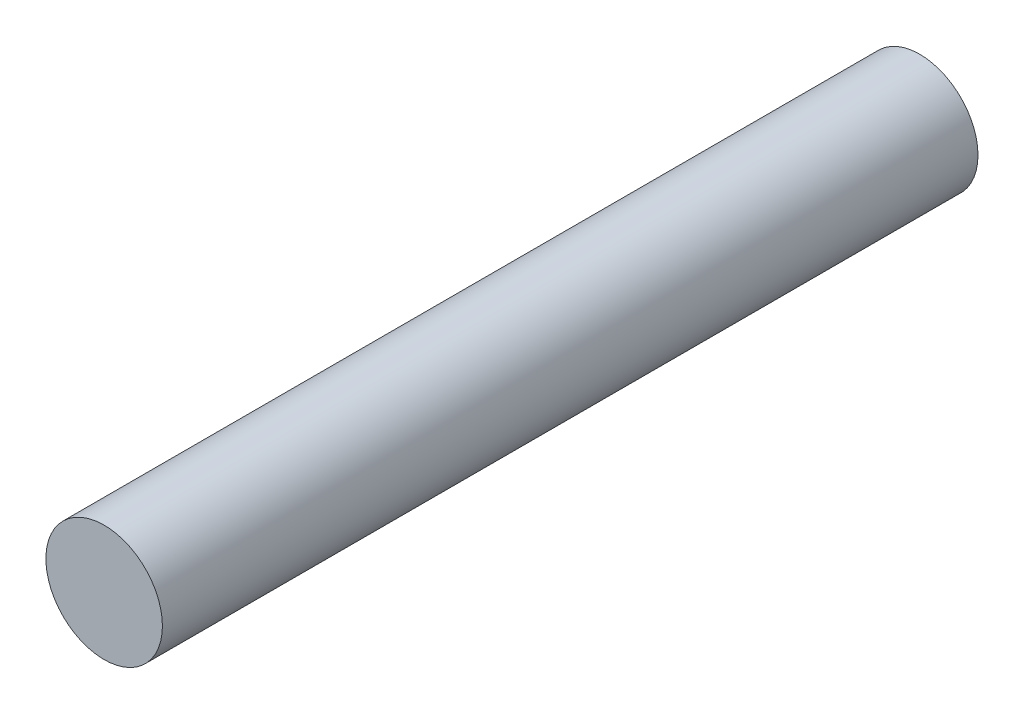
ISO-10303-21;
HEADER;
FILE_DESCRIPTION(('STEP AP214'),'2;1');
FILE_NAME('part.step','',(''),(''),'','','');
FILE_SCHEMA(('AUTOMOTIVE_DESIGN { 1 0 10303 214 1 1 1 1 }'));
ENDSEC;
DATA;
#1=APPLICATION_CONTEXT('core data for automotive mechanical design processes');
#2=APPLICATION_PROTOCOL_DEFINITION('international standard','automotive_design',2000,#1);
#3=PRODUCT_CONTEXT('',#1,'mechanical');
#4=PRODUCT('Part','Part','',(#3));
#5=PRODUCT_RELATED_PRODUCT_CATEGORY('part','',(#4));
#6=PRODUCT_DEFINITION_FORMATION('','',#4);
#7=PRODUCT_DEFINITION_CONTEXT('part definition',#1,'design');
#8=PRODUCT_DEFINITION('design','',#6,#7);
#9=PRODUCT_DEFINITION_SHAPE('','',#8);
#10=(LENGTH_UNIT() NAMED_UNIT(*) SI_UNIT(.MILLI.,.METRE.));
#11=(NAMED_UNIT(*) PLANE_ANGLE_UNIT() SI_UNIT($,.RADIAN.));
#12=(NAMED_UNIT(*) SI_UNIT($,.STERADIAN.) SOLID_ANGLE_UNIT());
#13=UNCERTAINTY_MEASURE_WITH_UNIT(LENGTH_MEASURE(1.E-05),#10,'distance_accuracy_value','');
#14=(GEOMETRIC_REPRESENTATION_CONTEXT(3) GLOBAL_UNCERTAINTY_ASSIGNED_CONTEXT((#13)) GLOBAL_UNIT_ASSIGNED_CONTEXT((#10,
#11,#12)) REPRESENTATION_CONTEXT('',''));
#15=CARTESIAN_POINT('',(0.,0.,0.));
#16=DIRECTION('',(0.,0.,1.));
#17=DIRECTION('',(1.,0.,0.));
#18=AXIS2_PLACEMENT_3D('',#15,#16,#17);
#19=CARTESIAN_POINT('',(0.,0.,3.5));
#20=DIRECTION('',(0.,0.,-1.));
#21=DIRECTION('',(-1.,0.,0.));
#22=AXIS2_PLACEMENT_3D('',#19,#20,#21);
#23=CYLINDRICAL_SURFACE('',#22,0.25);
#24=CARTESIAN_POINT('',(0.,0.,3.5));
#25=DIRECTION('',(0.,0.,1.));
#26=DIRECTION('',(1.,0.,0.));
#27=AXIS2_PLACEMENT_3D('',#24,#25,#26);
#28=CIRCLE('',#27,0.25);
#29=CARTESIAN_POINT('',(0.25,0.,3.5));
#30=VERTEX_POINT('',#29);
#31=EDGE_CURVE('E10',#30,#30,#28,.T.);
#32=ORIENTED_EDGE('',*,*,#31,.F.);
#33=EDGE_LOOP('',(#32));
#34=FACE_BOUND('',#33,.T.);
#35=CARTESIAN_POINT('',(0.,0.,0.));
#36=DIRECTION('',(0.,0.,1.));
#37=DIRECTION('',(1.,0.,0.));
#38=AXIS2_PLACEMENT_3D('',#35,#36,#37);
#39=CIRCLE('',#38,0.25);
#40=CARTESIAN_POINT('',(0.25,0.,0.));
#41=VERTEX_POINT('',#40);
#42=EDGE_CURVE('E37',#41,#41,#39,.T.);
#43=ORIENTED_EDGE('',*,*,#42,.T.);
#44=EDGE_LOOP('',(#43));
#45=FACE_BOUND('',#44,.T.);
#46=ADVANCED_FACE('F34',(#34,#45),#23,.T.);
#47=CARTESIAN_POINT('',(0.,0.,3.5));
#48=DIRECTION('',(0.,0.,1.));
#49=DIRECTION('',(1.,0.,0.));
#50=AXIS2_PLACEMENT_3D('',#47,#48,#49);
#51=PLANE('',#50);
#52=ORIENTED_EDGE('',*,*,#31,.T.);
#53=EDGE_LOOP('',(#52));
#54=FACE_BOUND('',#53,.T.);
#55=ADVANCED_FACE('F49',(#54),#51,.T.);
#56=CARTESIAN_POINT('',(0.,0.,0.));
#57=DIRECTION('',(0.,0.,1.));
#58=DIRECTION('',(1.,0.,0.));
#59=AXIS2_PLACEMENT_3D('',#56,#57,#58);
#60=PLANE('',#59);
#61=ORIENTED_EDGE('',*,*,#42,.F.);
#62=EDGE_LOOP('',(#61));
#63=FACE_BOUND('',#62,.T.);
#64=ADVANCED_FACE('F47',(#63),#60,.F.);
#65=CLOSED_SHELL('',(#46,#55,#64));
#66=MANIFOLD_SOLID_BREP('B2',#65);
#67=ADVANCED_BREP_SHAPE_REPRESENTATION('',(#18,#66),#14);
#68=SHAPE_DEFINITION_REPRESENTATION(#9,#67);
ENDSEC;
END-ISO-10303-21;
